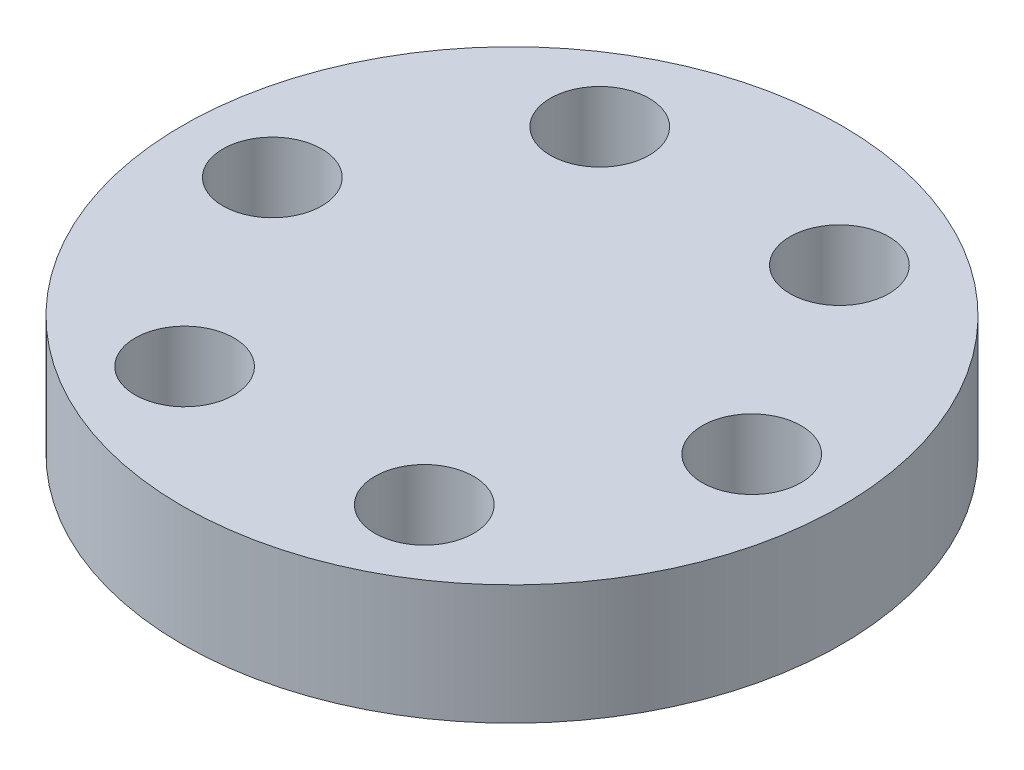
ISO-10303-21;
HEADER;
FILE_DESCRIPTION(('STEP AP214'),'2;1');
FILE_NAME('part.step','',(''),(''),'','','');
FILE_SCHEMA(('AUTOMOTIVE_DESIGN { 1 0 10303 214 1 1 1 1 }'));
ENDSEC;
DATA;
#1=APPLICATION_CONTEXT('core data for automotive mechanical design processes');
#2=APPLICATION_PROTOCOL_DEFINITION('international standard','automotive_design',2000,#1);
#3=PRODUCT_CONTEXT('',#1,'mechanical');
#4=PRODUCT('Part','Part','',(#3));
#5=PRODUCT_RELATED_PRODUCT_CATEGORY('part','',(#4));
#6=PRODUCT_DEFINITION_FORMATION('','',#4);
#7=PRODUCT_DEFINITION_CONTEXT('part definition',#1,'design');
#8=PRODUCT_DEFINITION('design','',#6,#7);
#9=PRODUCT_DEFINITION_SHAPE('','',#8);
#10=(LENGTH_UNIT() NAMED_UNIT(*) SI_UNIT(.MILLI.,.METRE.));
#11=(NAMED_UNIT(*) PLANE_ANGLE_UNIT() SI_UNIT($,.RADIAN.));
#12=(NAMED_UNIT(*) SI_UNIT($,.STERADIAN.) SOLID_ANGLE_UNIT());
#13=UNCERTAINTY_MEASURE_WITH_UNIT(LENGTH_MEASURE(1.E-05),#10,'distance_accuracy_value','');
#14=(GEOMETRIC_REPRESENTATION_CONTEXT(3) GLOBAL_UNCERTAINTY_ASSIGNED_CONTEXT((#13)) GLOBAL_UNIT_ASSIGNED_CONTEXT((#10,
#11,#12)) REPRESENTATION_CONTEXT('',''));
#15=CARTESIAN_POINT('',(0.,0.,0.));
#16=DIRECTION('',(0.,0.,1.));
#17=DIRECTION('',(1.,0.,0.));
#18=AXIS2_PLACEMENT_3D('',#15,#16,#17);
#19=CARTESIAN_POINT('',(0.,4.,0.));
#20=DIRECTION('',(0.,1.,0.));
#21=DIRECTION('',(0.,0.,1.));
#22=AXIS2_PLACEMENT_3D('',#19,#20,#21);
#23=PLANE('',#22);
#24=CARTESIAN_POINT('',(-4.,4.,6.92820323027551));
#25=DIRECTION('',(0.,1.,0.));
#26=DIRECTION('',(0.,0.,1.));
#27=AXIS2_PLACEMENT_3D('',#24,#25,#26);
#28=CIRCLE('',#27,1.65);
#29=CARTESIAN_POINT('',(-4.,4.,8.57820323027551));
#30=VERTEX_POINT('',#29);
#31=EDGE_CURVE('E86',#30,#30,#28,.T.);
#32=ORIENTED_EDGE('',*,*,#31,.F.);
#33=EDGE_LOOP('',(#32));
#34=FACE_BOUND('',#33,.T.);
#35=CARTESIAN_POINT('',(8.,4.,0.));
#36=DIRECTION('',(0.,1.,0.));
#37=DIRECTION('',(0.,0.,1.));
#38=AXIS2_PLACEMENT_3D('',#35,#36,#37);
#39=CIRCLE('',#38,1.65);
#40=CARTESIAN_POINT('',(8.,4.,1.65));
#41=VERTEX_POINT('',#40);
#42=EDGE_CURVE('E70',#41,#41,#39,.T.);
#43=ORIENTED_EDGE('',*,*,#42,.F.);
#44=EDGE_LOOP('',(#43));
#45=FACE_BOUND('',#44,.T.);
#46=CARTESIAN_POINT('',(-4.,4.,-6.92820323027551));
#47=DIRECTION('',(0.,1.,0.));
#48=DIRECTION('',(0.,0.,1.));
#49=AXIS2_PLACEMENT_3D('',#46,#47,#48);
#50=CIRCLE('',#49,1.65);
#51=CARTESIAN_POINT('',(-4.,4.,-5.27820323027551));
#52=VERTEX_POINT('',#51);
#53=EDGE_CURVE('E56',#52,#52,#50,.T.);
#54=ORIENTED_EDGE('',*,*,#53,.F.);
#55=EDGE_LOOP('',(#54));
#56=FACE_BOUND('',#55,.T.);
#57=CARTESIAN_POINT('',(0.,4.,0.));
#58=DIRECTION('',(0.,1.,0.));
#59=DIRECTION('',(0.,0.,1.));
#60=AXIS2_PLACEMENT_3D('',#57,#58,#59);
#61=CIRCLE('',#60,11.);
#62=CARTESIAN_POINT('',(0.,4.,11.));
#63=VERTEX_POINT('',#62);
#64=EDGE_CURVE('E10',#63,#63,#61,.T.);
#65=ORIENTED_EDGE('',*,*,#64,.T.);
#66=EDGE_LOOP('',(#65));
#67=FACE_BOUND('',#66,.T.);
#68=CARTESIAN_POINT('',(4.,4.,-6.92820323027551));
#69=DIRECTION('',(0.,1.,0.));
#70=DIRECTION('',(0.,0.,1.));
#71=AXIS2_PLACEMENT_3D('',#68,#69,#70);
#72=CIRCLE('',#71,1.65);
#73=CARTESIAN_POINT('',(4.,4.,-5.27820323027551));
#74=VERTEX_POINT('',#73);
#75=EDGE_CURVE('E62',#74,#74,#72,.T.);
#76=ORIENTED_EDGE('',*,*,#75,.F.);
#77=EDGE_LOOP('',(#76));
#78=FACE_BOUND('',#77,.T.);
#79=CARTESIAN_POINT('',(4.,4.,6.92820323027551));
#80=DIRECTION('',(0.,1.,0.));
#81=DIRECTION('',(0.,0.,1.));
#82=AXIS2_PLACEMENT_3D('',#79,#80,#81);
#83=CIRCLE('',#82,1.65);
#84=CARTESIAN_POINT('',(4.,4.,8.57820323027551));
#85=VERTEX_POINT('',#84);
#86=EDGE_CURVE('E78',#85,#85,#83,.T.);
#87=ORIENTED_EDGE('',*,*,#86,.F.);
#88=EDGE_LOOP('',(#87));
#89=FACE_BOUND('',#88,.T.);
#90=CARTESIAN_POINT('',(-8.,4.,0.));
#91=DIRECTION('',(0.,1.,0.));
#92=DIRECTION('',(0.,0.,1.));
#93=AXIS2_PLACEMENT_3D('',#90,#91,#92);
#94=CIRCLE('',#93,1.65);
#95=CARTESIAN_POINT('',(-8.,4.,1.65));
#96=VERTEX_POINT('',#95);
#97=EDGE_CURVE('E94',#96,#96,#94,.T.);
#98=ORIENTED_EDGE('',*,*,#97,.F.);
#99=EDGE_LOOP('',(#98));
#100=FACE_BOUND('',#99,.T.);
#101=ADVANCED_FACE('F43',(#34,#45,#56,#67,#78,#89,#100),#23,.T.);
#102=CARTESIAN_POINT('',(0.,0.,0.));
#103=DIRECTION('',(0.,1.,0.));
#104=DIRECTION('',(0.,0.,1.));
#105=AXIS2_PLACEMENT_3D('',#102,#103,#104);
#106=PLANE('',#105);
#107=CARTESIAN_POINT('',(0.,0.,0.));
#108=DIRECTION('',(0.,1.,0.));
#109=DIRECTION('',(0.,0.,1.));
#110=AXIS2_PLACEMENT_3D('',#107,#108,#109);
#111=CIRCLE('',#110,11.);
#112=CARTESIAN_POINT('',(0.,0.,11.));
#113=VERTEX_POINT('',#112);
#114=EDGE_CURVE('E47',#113,#113,#111,.T.);
#115=ORIENTED_EDGE('',*,*,#114,.F.);
#116=EDGE_LOOP('',(#115));
#117=FACE_BOUND('',#116,.T.);
#118=CARTESIAN_POINT('',(-4.,0.,-6.92820323027551));
#119=DIRECTION('',(0.,1.,0.));
#120=DIRECTION('',(0.,0.,1.));
#121=AXIS2_PLACEMENT_3D('',#118,#119,#120);
#122=CIRCLE('',#121,1.65);
#123=CARTESIAN_POINT('',(-4.,0.,-5.27820323027551));
#124=VERTEX_POINT('',#123);
#125=EDGE_CURVE('E58',#124,#124,#122,.T.);
#126=ORIENTED_EDGE('',*,*,#125,.T.);
#127=EDGE_LOOP('',(#126));
#128=FACE_BOUND('',#127,.T.);
#129=CARTESIAN_POINT('',(4.,0.,-6.92820323027551));
#130=DIRECTION('',(0.,1.,0.));
#131=DIRECTION('',(0.,0.,1.));
#132=AXIS2_PLACEMENT_3D('',#129,#130,#131);
#133=CIRCLE('',#132,1.65);
#134=CARTESIAN_POINT('',(4.,0.,-5.27820323027551));
#135=VERTEX_POINT('',#134);
#136=EDGE_CURVE('E66',#135,#135,#133,.T.);
#137=ORIENTED_EDGE('',*,*,#136,.T.);
#138=EDGE_LOOP('',(#137));
#139=FACE_BOUND('',#138,.T.);
#140=CARTESIAN_POINT('',(8.,0.,0.));
#141=DIRECTION('',(0.,1.,0.));
#142=DIRECTION('',(0.,0.,1.));
#143=AXIS2_PLACEMENT_3D('',#140,#141,#142);
#144=CIRCLE('',#143,1.65);
#145=CARTESIAN_POINT('',(8.,0.,1.65));
#146=VERTEX_POINT('',#145);
#147=EDGE_CURVE('E74',#146,#146,#144,.T.);
#148=ORIENTED_EDGE('',*,*,#147,.T.);
#149=EDGE_LOOP('',(#148));
#150=FACE_BOUND('',#149,.T.);
#151=CARTESIAN_POINT('',(4.,0.,6.92820323027551));
#152=DIRECTION('',(0.,1.,0.));
#153=DIRECTION('',(0.,0.,1.));
#154=AXIS2_PLACEMENT_3D('',#151,#152,#153);
#155=CIRCLE('',#154,1.65);
#156=CARTESIAN_POINT('',(4.,0.,8.57820323027551));
#157=VERTEX_POINT('',#156);
#158=EDGE_CURVE('E82',#157,#157,#155,.T.);
#159=ORIENTED_EDGE('',*,*,#158,.T.);
#160=EDGE_LOOP('',(#159));
#161=FACE_BOUND('',#160,.T.);
#162=CARTESIAN_POINT('',(-4.,0.,6.92820323027551));
#163=DIRECTION('',(0.,1.,0.));
#164=DIRECTION('',(0.,0.,1.));
#165=AXIS2_PLACEMENT_3D('',#162,#163,#164);
#166=CIRCLE('',#165,1.65);
#167=CARTESIAN_POINT('',(-4.,0.,8.57820323027551));
#168=VERTEX_POINT('',#167);
#169=EDGE_CURVE('E90',#168,#168,#166,.T.);
#170=ORIENTED_EDGE('',*,*,#169,.T.);
#171=EDGE_LOOP('',(#170));
#172=FACE_BOUND('',#171,.T.);
#173=CARTESIAN_POINT('',(-8.,0.,0.));
#174=DIRECTION('',(0.,1.,0.));
#175=DIRECTION('',(0.,0.,1.));
#176=AXIS2_PLACEMENT_3D('',#173,#174,#175);
#177=CIRCLE('',#176,1.65);
#178=CARTESIAN_POINT('',(-8.,0.,1.65));
#179=VERTEX_POINT('',#178);
#180=EDGE_CURVE('E98',#179,#179,#177,.T.);
#181=ORIENTED_EDGE('',*,*,#180,.T.);
#182=EDGE_LOOP('',(#181));
#183=FACE_BOUND('',#182,.T.);
#184=ADVANCED_FACE('F110',(#117,#128,#139,#150,#161,#172,#183),#106,.F.);
#185=CARTESIAN_POINT('',(0.,4.,0.));
#186=DIRECTION('',(0.,-1.,0.));
#187=DIRECTION('',(0.,0.,-1.));
#188=AXIS2_PLACEMENT_3D('',#185,#186,#187);
#189=CYLINDRICAL_SURFACE('',#188,11.);
#190=ORIENTED_EDGE('',*,*,#64,.F.);
#191=EDGE_LOOP('',(#190));
#192=FACE_BOUND('',#191,.T.);
#193=ORIENTED_EDGE('',*,*,#114,.T.);
#194=EDGE_LOOP('',(#193));
#195=FACE_BOUND('',#194,.T.);
#196=ADVANCED_FACE('F45',(#192,#195),#189,.T.);
#197=CARTESIAN_POINT('',(-4.,4.,-6.92820323027551));
#198=DIRECTION('',(0.,-1.,0.));
#199=DIRECTION('',(0.,0.,-1.));
#200=AXIS2_PLACEMENT_3D('',#197,#198,#199);
#201=CYLINDRICAL_SURFACE('',#200,1.65);
#202=ORIENTED_EDGE('',*,*,#53,.T.);
#203=EDGE_LOOP('',(#202));
#204=FACE_BOUND('',#203,.T.);
#205=ORIENTED_EDGE('',*,*,#125,.F.);
#206=EDGE_LOOP('',(#205));
#207=FACE_BOUND('',#206,.T.);
#208=ADVANCED_FACE('F120',(#204,#207),#201,.F.);
#209=CARTESIAN_POINT('',(4.,4.,-6.92820323027551));
#210=DIRECTION('',(0.,-1.,0.));
#211=DIRECTION('',(0.,0.,-1.));
#212=AXIS2_PLACEMENT_3D('',#209,#210,#211);
#213=CYLINDRICAL_SURFACE('',#212,1.65);
#214=ORIENTED_EDGE('',*,*,#75,.T.);
#215=EDGE_LOOP('',(#214));
#216=FACE_BOUND('',#215,.T.);
#217=ORIENTED_EDGE('',*,*,#136,.F.);
#218=EDGE_LOOP('',(#217));
#219=FACE_BOUND('',#218,.T.);
#220=ADVANCED_FACE('F123',(#216,#219),#213,.F.);
#221=CARTESIAN_POINT('',(8.,4.,0.));
#222=DIRECTION('',(0.,-1.,0.));
#223=DIRECTION('',(0.,0.,-1.));
#224=AXIS2_PLACEMENT_3D('',#221,#222,#223);
#225=CYLINDRICAL_SURFACE('',#224,1.65);
#226=ORIENTED_EDGE('',*,*,#42,.T.);
#227=EDGE_LOOP('',(#226));
#228=FACE_BOUND('',#227,.T.);
#229=ORIENTED_EDGE('',*,*,#147,.F.);
#230=EDGE_LOOP('',(#229));
#231=FACE_BOUND('',#230,.T.);
#232=ADVANCED_FACE('F127',(#228,#231),#225,.F.);
#233=CARTESIAN_POINT('',(4.,4.,6.92820323027551));
#234=DIRECTION('',(0.,-1.,0.));
#235=DIRECTION('',(0.,0.,-1.));
#236=AXIS2_PLACEMENT_3D('',#233,#234,#235);
#237=CYLINDRICAL_SURFACE('',#236,1.65);
#238=ORIENTED_EDGE('',*,*,#86,.T.);
#239=EDGE_LOOP('',(#238));
#240=FACE_BOUND('',#239,.T.);
#241=ORIENTED_EDGE('',*,*,#158,.F.);
#242=EDGE_LOOP('',(#241));
#243=FACE_BOUND('',#242,.T.);
#244=ADVANCED_FACE('F131',(#240,#243),#237,.F.);
#245=CARTESIAN_POINT('',(-4.,4.,6.92820323027551));
#246=DIRECTION('',(0.,-1.,0.));
#247=DIRECTION('',(0.,0.,-1.));
#248=AXIS2_PLACEMENT_3D('',#245,#246,#247);
#249=CYLINDRICAL_SURFACE('',#248,1.65);
#250=ORIENTED_EDGE('',*,*,#31,.T.);
#251=EDGE_LOOP('',(#250));
#252=FACE_BOUND('',#251,.T.);
#253=ORIENTED_EDGE('',*,*,#169,.F.);
#254=EDGE_LOOP('',(#253));
#255=FACE_BOUND('',#254,.T.);
#256=ADVANCED_FACE('F135',(#252,#255),#249,.F.);
#257=CARTESIAN_POINT('',(-8.,4.,0.));
#258=DIRECTION('',(0.,-1.,0.));
#259=DIRECTION('',(0.,0.,-1.));
#260=AXIS2_PLACEMENT_3D('',#257,#258,#259);
#261=CYLINDRICAL_SURFACE('',#260,1.65);
#262=ORIENTED_EDGE('',*,*,#97,.T.);
#263=EDGE_LOOP('',(#262));
#264=FACE_BOUND('',#263,.T.);
#265=ORIENTED_EDGE('',*,*,#180,.F.);
#266=EDGE_LOOP('',(#265));
#267=FACE_BOUND('',#266,.T.);
#268=ADVANCED_FACE('F106',(#264,#267),#261,.F.);
#269=CLOSED_SHELL('',(#101,#184,#196,#208,#220,#232,#244,#256,#268));
#270=MANIFOLD_SOLID_BREP('B2',#269);
#271=ADVANCED_BREP_SHAPE_REPRESENTATION('',(#18,#270),#14);
#272=SHAPE_DEFINITION_REPRESENTATION(#9,#271);
ENDSEC;
END-ISO-10303-21;
